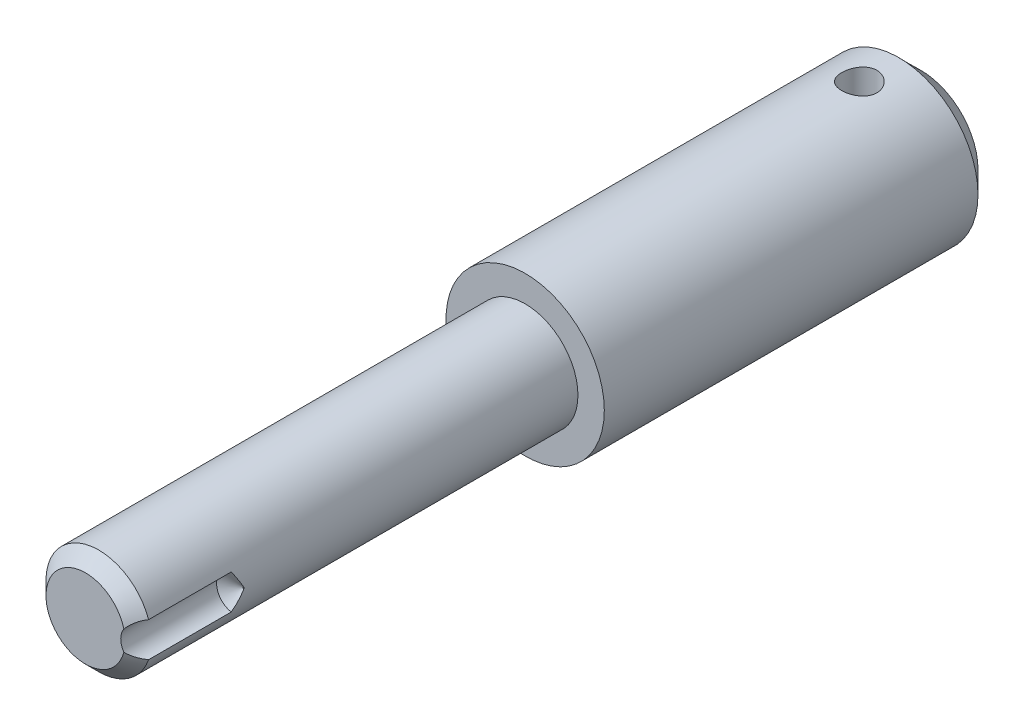
ISO-10303-21;
HEADER;
FILE_DESCRIPTION(('STEP AP214'),'2;1');
FILE_NAME('part.step','',(''),(''),'','','');
FILE_SCHEMA(('AUTOMOTIVE_DESIGN { 1 0 10303 214 1 1 1 1 }'));
ENDSEC;
DATA;
#1=APPLICATION_CONTEXT('core data for automotive mechanical design processes');
#2=APPLICATION_PROTOCOL_DEFINITION('international standard','automotive_design',2000,#1);
#3=PRODUCT_CONTEXT('',#1,'mechanical');
#4=PRODUCT('Part','Part','',(#3));
#5=PRODUCT_RELATED_PRODUCT_CATEGORY('part','',(#4));
#6=PRODUCT_DEFINITION_FORMATION('','',#4);
#7=PRODUCT_DEFINITION_CONTEXT('part definition',#1,'design');
#8=PRODUCT_DEFINITION('design','',#6,#7);
#9=PRODUCT_DEFINITION_SHAPE('','',#8);
#10=(LENGTH_UNIT() NAMED_UNIT(*) SI_UNIT(.MILLI.,.METRE.));
#11=(NAMED_UNIT(*) PLANE_ANGLE_UNIT() SI_UNIT($,.RADIAN.));
#12=(NAMED_UNIT(*) SI_UNIT($,.STERADIAN.) SOLID_ANGLE_UNIT());
#13=UNCERTAINTY_MEASURE_WITH_UNIT(LENGTH_MEASURE(1.E-05),#10,'distance_accuracy_value','');
#14=(GEOMETRIC_REPRESENTATION_CONTEXT(3) GLOBAL_UNCERTAINTY_ASSIGNED_CONTEXT((#13)) GLOBAL_UNIT_ASSIGNED_CONTEXT((#10,
#11,#12)) REPRESENTATION_CONTEXT('',''));
#15=CARTESIAN_POINT('',(0.,0.,0.));
#16=DIRECTION('',(0.,0.,1.));
#17=DIRECTION('',(1.,0.,0.));
#18=AXIS2_PLACEMENT_3D('',#15,#16,#17);
#19=CARTESIAN_POINT('',(0.,0.,95.));
#20=DIRECTION('',(0.,0.,1.));
#21=DIRECTION('',(1.,0.,0.));
#22=AXIS2_PLACEMENT_3D('',#19,#20,#21);
#23=PLANE('',#22);
#24=CARTESIAN_POINT('',(6.,0.,95.));
#25=DIRECTION('',(0.,0.,1.));
#26=DIRECTION('',(1.,0.,0.));
#27=AXIS2_PLACEMENT_3D('',#24,#25,#26);
#28=CIRCLE('',#27,2.);
#29=CARTESIAN_POINT('',(4.35416666667212,-1.13632417861579,94.9999999999449));
#30=VERTEX_POINT('',#29);
#31=CARTESIAN_POINT('',(4.35416666668207,1.13632417863019,94.9999999999568));
#32=VERTEX_POINT('',#31);
#33=EDGE_CURVE('E56',#30,#32,#28,.F.);
#34=ORIENTED_EDGE('',*,*,#33,.T.);
#35=CARTESIAN_POINT('',(0.,0.,94.9999999999136));
#36=DIRECTION('',(0.,0.,-1.));
#37=DIRECTION('',(-1.,0.,0.));
#38=AXIS2_PLACEMENT_3D('',#35,#36,#37);
#39=CIRCLE('',#38,4.50000000000728);
#40=EDGE_CURVE('E19',#30,#32,#39,.T.);
#41=ORIENTED_EDGE('',*,*,#40,.F.);
#42=EDGE_LOOP('',(#34,#41));
#43=FACE_BOUND('',#42,.T.);
#44=ADVANCED_FACE('F16',(#43),#23,.T.);
#45=CARTESIAN_POINT('',(0.,0.,93.4999999998354));
#46=DIRECTION('',(0.,0.,-1.));
#47=DIRECTION('',(-1.,0.,0.));
#48=AXIS2_PLACEMENT_3D('',#45,#46,#47);
#49=CONICAL_SURFACE('',#48,6.00000000008549,0.785398163397448);
#50=CARTESIAN_POINT('',(5.66666666662766,-1.97202659435995,93.4999999999599));
#51=CARTESIAN_POINT('',(5.58731136370315,-1.95858936429897,93.579338944694));
#52=CARTESIAN_POINT('',(5.509157179507,-1.94047495928973,93.6590825169533));
#53=CARTESIAN_POINT('',(5.35575247808671,-1.89509148490717,93.8188589984732));
#54=CARTESIAN_POINT('',(5.28050382108905,-1.86781665559849,93.8988920583595));
#55=CARTESIAN_POINT('',(5.13547117172848,-1.8051752543343,94.0564982341649));
#56=CARTESIAN_POINT('',(5.0655949983307,-1.77004363952568,94.1340800774683));
#57=CARTESIAN_POINT('',(4.92967321608421,-1.69132176651743,94.2882813796422));
#58=CARTESIAN_POINT('',(4.86362625100813,-1.64773452719373,94.3649011716257));
#59=CARTESIAN_POINT('',(4.75878945441707,-1.56908252521949,94.4892274532315));
#60=CARTESIAN_POINT('',(4.71870807082045,-1.53655490883224,94.5374628580181));
#61=CARTESIAN_POINT('',(4.64053645921032,-1.46784362500749,94.6328947923491));
#62=CARTESIAN_POINT('',(4.60244529845824,-1.43166169395065,94.6800918024337));
#63=CARTESIAN_POINT('',(4.5277986558606,-1.35482377701303,94.7739218537631));
#64=CARTESIAN_POINT('',(4.49128124529534,-1.31410110185055,94.8205309328682));
#65=CARTESIAN_POINT('',(4.42075421291011,-1.22843207351874,94.9118452581847));
#66=CARTESIAN_POINT('',(4.38674756671663,-1.18348084788457,94.9565482196868));
#67=CARTESIAN_POINT('',(4.35416666666589,-1.13632417860678,94.9999999999219));
#68=B_SPLINE_CURVE_WITH_KNOTS('',3,(#50,#51,#52,#53,#54,#55,#56,#57,#58,#59,#60,#61,#62,#63,#64,
#65,#66,#67),.UNSPECIFIED.,.F.,.F.,(4,2,2,2,2,2,2,2,4),(0.,0.338940173485475,0.678093867641629,
1.00821121188998,1.33821091192882,1.55004340594938,1.76177571520094,1.97717868630045,
2.19283297487962),.UNSPECIFIED.);
#69=CARTESIAN_POINT('',(5.66666666664716,-1.97202659436324,93.4999999999799));
#70=VERTEX_POINT('',#69);
#71=EDGE_CURVE('E60',#70,#30,#68,.T.);
#72=ORIENTED_EDGE('',*,*,#71,.T.);
#73=ORIENTED_EDGE('',*,*,#40,.T.);
#74=CARTESIAN_POINT('',(4.35416666667264,1.13632417860418,94.999999999926));
#75=CARTESIAN_POINT('',(4.39304536174543,1.19257156844811,94.9481413201713));
#76=CARTESIAN_POINT('',(4.43393721165323,1.24569186644444,94.8945342350087));
#77=CARTESIAN_POINT('',(4.51921207968946,1.34596796096177,94.7847585413084));
#78=CARTESIAN_POINT('',(4.56358997567593,1.39313225242374,94.7285937400997));
#79=CARTESIAN_POINT('',(4.65450715662631,1.4810665020417,94.6156136062617));
#80=CARTESIAN_POINT('',(4.70098620736714,1.52194462483922,94.5588332029434));
#81=CARTESIAN_POINT('',(4.79660832054046,1.59862693526952,94.4440537809019));
#82=CARTESIAN_POINT('',(4.8457526408926,1.63442869770334,94.3860541948134));
#83=CARTESIAN_POINT('',(4.95411301675924,1.7061541538256,94.2603543914784));
#84=CARTESIAN_POINT('',(5.01372091250635,1.7412612254855,94.1925256077805));
#85=CARTESIAN_POINT('',(5.13573681170663,1.80493297202715,94.0563355975283));
#86=CARTESIAN_POINT('',(5.19814468578378,1.83349794882192,93.9879743956954));
#87=CARTESIAN_POINT('',(5.32692875968902,1.88464599434818,93.8495095382937));
#88=CARTESIAN_POINT('',(5.39336376544579,1.90707260684141,93.779402708909));
#89=CARTESIAN_POINT('',(5.52844750188661,1.94487612929675,93.6394285076216));
#90=CARTESIAN_POINT('',(5.59709613623139,1.96025334561345,93.569561125444));
#91=CARTESIAN_POINT('',(5.66666666663748,1.97202659436161,93.4999999999501));
#92=B_SPLINE_CURVE_WITH_KNOTS('',3,(#74,#75,#76,#77,#78,#79,#80,#81,#82,#83,#84,#85,#86,#87,#88,
#89,#90,#91),.UNSPECIFIED.,.F.,.F.,(4,2,2,2,2,2,2,2,4),(0.,0.257236987339272,0.514102835929855,
0.765880065960838,1.01777717858197,1.30814924996324,1.59850791817821,1.89569423241721,
2.19286763022798),.UNSPECIFIED.);
#93=CARTESIAN_POINT('',(5.66666666665207,1.97202659436407,93.499999999975));
#94=VERTEX_POINT('',#93);
#95=EDGE_CURVE('E59',#32,#94,#92,.T.);
#96=ORIENTED_EDGE('',*,*,#95,.T.);
#97=CARTESIAN_POINT('',(0.,0.,93.5));
#98=DIRECTION('',(0.,0.,1.));
#99=DIRECTION('',(1.,0.,0.));
#100=AXIS2_PLACEMENT_3D('',#97,#98,#99);
#101=CIRCLE('',#100,6.);
#102=EDGE_CURVE('E116',#70,#94,#101,.F.);
#103=ORIENTED_EDGE('',*,*,#102,.F.);
#104=EDGE_LOOP('',(#72,#73,#96,#103));
#105=FACE_BOUND('',#104,.T.);
#106=ADVANCED_FACE('F63',(#105),#49,.T.);
#107=CARTESIAN_POINT('',(6.,0.,83.));
#108=DIRECTION('',(0.,0.,1.));
#109=DIRECTION('',(1.,0.,0.));
#110=AXIS2_PLACEMENT_3D('',#107,#108,#109);
#111=CYLINDRICAL_SURFACE('',#110,2.);
#112=DIRECTION('',(0.,0.,1.));
#113=VECTOR('',#112,1.);
#114=CARTESIAN_POINT('',(5.66666666666667,1.97202659436654,45.));
#115=LINE('',#114,#113);
#116=CARTESIAN_POINT('',(5.66666666666298,1.97202659437715,84.0969655114295));
#117=VERTEX_POINT('',#116);
#118=EDGE_CURVE('E68',#94,#117,#115,.F.);
#119=ORIENTED_EDGE('',*,*,#118,.F.);
#120=ORIENTED_EDGE('',*,*,#95,.F.);
#121=ORIENTED_EDGE('',*,*,#33,.F.);
#122=ORIENTED_EDGE('',*,*,#71,.F.);
#123=DIRECTION('',(0.,0.,1.));
#124=VECTOR('',#123,1.);
#125=CARTESIAN_POINT('',(5.66666666666667,-1.97202659436654,45.));
#126=LINE('',#125,#124);
#127=CARTESIAN_POINT('',(5.66666666666301,-1.97202659437705,84.0969655114231));
#128=VERTEX_POINT('',#127);
#129=EDGE_CURVE('E117',#128,#70,#126,.T.);
#130=ORIENTED_EDGE('',*,*,#129,.F.);
#131=CARTESIAN_POINT('',(6.,0.,84.096965511435));
#132=DIRECTION('',(0.,0.,1.));
#133=DIRECTION('',(0.579365558572824,0.815067818981709,0.));
#134=AXIS2_PLACEMENT_3D('',#131,#132,#133);
#135=CIRCLE('',#134,2.00000000002195);
#136=EDGE_CURVE('E70',#128,#117,#135,.F.);
#137=ORIENTED_EDGE('',*,*,#136,.T.);
#138=EDGE_LOOP('',(#119,#120,#121,#122,#130,#137));
#139=FACE_BOUND('',#138,.T.);
#140=ADVANCED_FACE('F66',(#139),#111,.F.);
#141=CARTESIAN_POINT('',(6.,0.,84.0969655113781));
#142=DIRECTION('',(0.,0.,1.));
#143=DIRECTION('',(1.,0.,0.));
#144=AXIS2_PLACEMENT_3D('',#141,#142,#143);
#145=CONICAL_SURFACE('',#144,1.99999999994269,1.04719755119325);
#146=CARTESIAN_POINT('',(5.9991666666654,-0.0999965277937368,82.9999999999865));
#147=CARTESIAN_POINT('',(5.99865088310176,-0.130933498080339,83.0178633385989));
#148=CARTESIAN_POINT('',(5.99789591844705,-0.161866631215194,83.0357261774191));
#149=CARTESIAN_POINT('',(5.99292386779685,-0.316539438930122,83.1250611272435));
#150=CARTESIAN_POINT('',(5.98511654081106,-0.440175351418314,83.1965232358825));
#151=CARTESIAN_POINT('',(5.95091151429016,-0.802693533145837,83.4065204181975));
#152=CARTESIAN_POINT('',(5.91393953940296,-1.04072609992603,83.5449965645683));
#153=CARTESIAN_POINT('',(5.83717359672253,-1.39354463856193,83.7522676408795));
#154=CARTESIAN_POINT('',(5.80798650860087,-1.51058147220522,83.8213654813088));
#155=CARTESIAN_POINT('',(5.742580327098,-1.74278690188049,83.959335689711));
#156=CARTESIAN_POINT('',(5.70636213749171,-1.85795573596498,84.0282080855067));
#157=CARTESIAN_POINT('',(5.66666666665989,-1.97202659438602,84.096965511423));
#158=B_SPLINE_CURVE_WITH_KNOTS('',3,(#146,#147,#148,#149,#150,#151,#152,#153,#154,#155,#156,
#157),.UNSPECIFIED.,.F.,.F.,(4,2,2,2,2,4),(0.,0.107182082140011,0.536054947589333,
1.36783609831082,1.78471247193166,2.20153529587136),.UNSPECIFIED.);
#159=CARTESIAN_POINT('',(5.99916666666563,-0.0999965277794674,82.9999999999782));
#160=VERTEX_POINT('',#159);
#161=EDGE_CURVE('E121',#160,#128,#158,.T.);
#162=ORIENTED_EDGE('',*,*,#161,.F.);
#163=CARTESIAN_POINT('',(6.,0.,82.99999999997));
#164=DIRECTION('',(0.,0.,1.));
#165=DIRECTION('',(1.,0.,0.));
#166=AXIS2_PLACEMENT_3D('',#163,#164,#165);
#167=CIRCLE('',#166,0.100000000047708);
#168=CARTESIAN_POINT('',(5.99916666666562,0.0999965277800654,82.999999999985));
#169=VERTEX_POINT('',#168);
#170=EDGE_CURVE('E34',#169,#160,#167,.T.);
#171=ORIENTED_EDGE('',*,*,#170,.F.);
#172=CARTESIAN_POINT('',(5.6666666666506,1.97202659437947,84.0969655114327));
#173=CARTESIAN_POINT('',(5.71921608802036,1.82105499504673,84.0059645624108));
#174=CARTESIAN_POINT('',(5.76566825439628,1.66810620039182,83.9147321723378));
#175=CARTESIAN_POINT('',(5.84600888436437,1.3599220164781,83.7323479634943));
#176=CARTESIAN_POINT('',(5.87995576324741,1.20470087341881,83.6411978065781));
#177=CARTESIAN_POINT('',(5.93541704144762,0.892193374289542,83.4586582530945));
#178=CARTESIAN_POINT('',(5.95693145819293,0.734907021114945,83.3672688568625));
#179=CARTESIAN_POINT('',(5.98751366626954,0.41844961046789,83.1839238881222));
#180=CARTESIAN_POINT('',(5.99652178962165,0.259273147541466,83.0919676897104));
#181=CARTESIAN_POINT('',(5.9991666666654,0.0999965277937354,82.9999999999865));
#182=B_SPLINE_CURVE_WITH_KNOTS('',3,(#172,#173,#174,#175,#176,#177,#178,#179,#180,#181),
.UNSPECIFIED.,.F.,.F.,(4,2,2,2,4),(0.,0.55171142461075,1.10081196882789,1.64991174330028,
2.20162239318301),.UNSPECIFIED.);
#183=EDGE_CURVE('E123',#117,#169,#182,.T.);
#184=ORIENTED_EDGE('',*,*,#183,.F.);
#185=ORIENTED_EDGE('',*,*,#136,.F.);
#186=EDGE_LOOP('',(#162,#171,#184,#185));
#187=FACE_BOUND('',#186,.T.);
#188=ADVANCED_FACE('F92',(#187),#145,.F.);
#189=CARTESIAN_POINT('',(0.,0.,83.));
#190=DIRECTION('',(0.,0.,1.));
#191=DIRECTION('',(1.,0.,0.));
#192=AXIS2_PLACEMENT_3D('',#189,#190,#191);
#193=PLANE('',#192);
#194=ORIENTED_EDGE('',*,*,#170,.T.);
#195=CARTESIAN_POINT('',(0.,0.,83.));
#196=DIRECTION('',(0.,0.,1.));
#197=DIRECTION('',(1.,0.,0.));
#198=AXIS2_PLACEMENT_3D('',#195,#196,#197);
#199=CIRCLE('',#198,6.);
#200=EDGE_CURVE('E142',#169,#160,#199,.F.);
#201=ORIENTED_EDGE('',*,*,#200,.F.);
#202=EDGE_LOOP('',(#194,#201));
#203=FACE_BOUND('',#202,.T.);
#204=ADVANCED_FACE('F159',(#203),#193,.T.);
#205=CARTESIAN_POINT('',(0.,0.,45.));
#206=DIRECTION('',(0.,0.,1.));
#207=DIRECTION('',(1.,0.,0.));
#208=AXIS2_PLACEMENT_3D('',#205,#206,#207);
#209=CYLINDRICAL_SURFACE('',#208,6.);
#210=CARTESIAN_POINT('',(0.,0.,45.));
#211=DIRECTION('',(0.,0.,1.));
#212=DIRECTION('',(1.,0.,0.));
#213=AXIS2_PLACEMENT_3D('',#210,#211,#212);
#214=CIRCLE('',#213,6.);
#215=CARTESIAN_POINT('',(6.,0.,45.));
#216=VERTEX_POINT('',#215);
#217=EDGE_CURVE('E137',#216,#216,#214,.F.);
#218=ORIENTED_EDGE('',*,*,#217,.F.);
#219=EDGE_LOOP('',(#218));
#220=FACE_BOUND('',#219,.T.);
#221=ORIENTED_EDGE('',*,*,#183,.T.);
#222=ORIENTED_EDGE('',*,*,#200,.T.);
#223=ORIENTED_EDGE('',*,*,#161,.T.);
#224=ORIENTED_EDGE('',*,*,#129,.T.);
#225=ORIENTED_EDGE('',*,*,#102,.T.);
#226=ORIENTED_EDGE('',*,*,#118,.T.);
#227=EDGE_LOOP('',(#221,#222,#223,#224,#225,#226));
#228=FACE_BOUND('',#227,.T.);
#229=ADVANCED_FACE('F154',(#220,#228),#209,.T.);
#230=CARTESIAN_POINT('',(0.,0.,0.));
#231=DIRECTION('',(0.,0.,1.));
#232=DIRECTION('',(1.,0.,0.));
#233=AXIS2_PLACEMENT_3D('',#230,#231,#232);
#234=PLANE('',#233);
#235=CARTESIAN_POINT('',(0.,0.,0.));
#236=DIRECTION('',(0.,0.,1.));
#237=DIRECTION('',(1.,0.,0.));
#238=AXIS2_PLACEMENT_3D('',#235,#236,#237);
#239=CIRCLE('',#238,6.5);
#240=CARTESIAN_POINT('',(6.5,0.,0.));
#241=VERTEX_POINT('',#240);
#242=EDGE_CURVE('E133',#241,#241,#239,.T.);
#243=ORIENTED_EDGE('',*,*,#242,.F.);
#244=EDGE_LOOP('',(#243));
#245=FACE_BOUND('',#244,.T.);
#246=ADVANCED_FACE('F158',(#245),#234,.F.);
#247=CARTESIAN_POINT('',(0.,0.,45.));
#248=DIRECTION('',(0.,0.,1.));
#249=DIRECTION('',(1.,0.,0.));
#250=AXIS2_PLACEMENT_3D('',#247,#248,#249);
#251=PLANE('',#250);
#252=ORIENTED_EDGE('',*,*,#217,.T.);
#253=EDGE_LOOP('',(#252));
#254=FACE_BOUND('',#253,.T.);
#255=CARTESIAN_POINT('',(0.,0.,45.));
#256=DIRECTION('',(0.,0.,1.));
#257=DIRECTION('',(1.,0.,0.));
#258=AXIS2_PLACEMENT_3D('',#255,#256,#257);
#259=CIRCLE('',#258,9.);
#260=CARTESIAN_POINT('',(9.,0.,45.));
#261=VERTEX_POINT('',#260);
#262=EDGE_CURVE('E128',#261,#261,#259,.F.);
#263=ORIENTED_EDGE('',*,*,#262,.F.);
#264=EDGE_LOOP('',(#263));
#265=FACE_BOUND('',#264,.T.);
#266=ADVANCED_FACE('F216',(#254,#265),#251,.T.);
#267=CARTESIAN_POINT('',(0.,0.,2.5));
#268=DIRECTION('',(0.,0.,1.));
#269=DIRECTION('',(1.,0.,0.));
#270=AXIS2_PLACEMENT_3D('',#267,#268,#269);
#271=CONICAL_SURFACE('',#270,9.,0.785398163397448);
#272=ORIENTED_EDGE('',*,*,#242,.T.);
#273=EDGE_LOOP('',(#272));
#274=FACE_BOUND('',#273,.T.);
#275=CARTESIAN_POINT('',(0.,0.,2.5));
#276=DIRECTION('',(0.,0.,1.));
#277=DIRECTION('',(1.,0.,0.));
#278=AXIS2_PLACEMENT_3D('',#275,#276,#277);
#279=CIRCLE('',#278,9.);
#280=CARTESIAN_POINT('',(9.,0.,2.5));
#281=VERTEX_POINT('',#280);
#282=EDGE_CURVE('E126',#281,#281,#279,.T.);
#283=ORIENTED_EDGE('',*,*,#282,.F.);
#284=EDGE_LOOP('',(#283));
#285=FACE_BOUND('',#284,.T.);
#286=ADVANCED_FACE('F101',(#274,#285),#271,.T.);
#287=CARTESIAN_POINT('',(0.,-25.,7.));
#288=DIRECTION('',(0.,1.,0.));
#289=DIRECTION('',(0.,0.,1.));
#290=AXIS2_PLACEMENT_3D('',#287,#288,#289);
#291=CYLINDRICAL_SURFACE('',#290,2.);
#292=CARTESIAN_POINT('',(2.,-8.77496438739212,7.));
#293=CARTESIAN_POINT('',(1.99999624947948,-8.77496662645733,6.88915763228401));
#294=CARTESIAN_POINT('',(1.99075413145665,-8.7770874535984,6.77827058734152));
#295=CARTESIAN_POINT('',(1.95407223666285,-8.78532539051412,6.55965317391113));
#296=CARTESIAN_POINT('',(1.92661957701425,-8.7914453293773,6.45192509658402));
#297=CARTESIAN_POINT('',(1.85442638312279,-8.80695492376764,6.24281957773034));
#298=CARTESIAN_POINT('',(1.8097051680061,-8.81634092424593,6.1414351859996));
#299=CARTESIAN_POINT('',(1.70430003435311,-8.83732066308218,5.94760499294287));
#300=CARTESIAN_POINT('',(1.64361633615812,-8.84891437096502,5.85515906825706));
#301=CARTESIAN_POINT('',(1.50688107459123,-8.87322903283376,5.68021742863161));
#302=CARTESIAN_POINT('',(1.4306036977922,-8.88596479825903,5.59790023788027));
#303=CARTESIAN_POINT('',(1.26533367886365,-8.91099903447159,5.44711724756097));
#304=CARTESIAN_POINT('',(1.17634002941518,-8.92329747051937,5.37865254635635));
#305=CARTESIAN_POINT('',(0.986963945237564,-8.94623292801725,5.25680924860468));
#306=CARTESIAN_POINT('',(0.886468216533076,-8.95685043407434,5.20360275054688));
#307=CARTESIAN_POINT('',(0.677686335651944,-8.97506024335485,5.11490019827952));
#308=CARTESIAN_POINT('',(0.569401088006953,-8.98265289716175,5.07940209152899));
#309=CARTESIAN_POINT('',(0.349970796328335,-8.99385284467252,5.02768656706115));
#310=CARTESIAN_POINT('',(0.238900228261922,-8.99752254926933,5.0111668907996));
#311=CARTESIAN_POINT('',(0.0155076577860236,-9.00067948952038,4.99693172912758));
#312=CARTESIAN_POINT('',(-0.0968141954765445,-9.00016721842944,4.99921402606618));
#313=CARTESIAN_POINT('',(-0.317435920934346,-8.99506549351281,5.02229372249603));
#314=CARTESIAN_POINT('',(-0.425771784327152,-8.99054779604675,5.0427652790911));
#315=CARTESIAN_POINT('',(-0.637430845543416,-8.97802477302305,5.10112266755516));
#316=CARTESIAN_POINT('',(-0.740753811742808,-8.97001928648017,5.13900930325326));
#317=CARTESIAN_POINT('',(-0.940353769390931,-8.95130538605655,5.23140697410095));
#318=CARTESIAN_POINT('',(-1.03657202089402,-8.94057712552793,5.28604071654444));
#319=CARTESIAN_POINT('',(-1.21859313654481,-8.91759271684017,5.410290093949));
#320=CARTESIAN_POINT('',(-1.30439453662954,-8.9053363543996,5.47990783106997));
#321=CARTESIAN_POINT('',(-1.46508498958083,-8.88033165726826,5.63392019385296));
#322=CARTESIAN_POINT('',(-1.53970021847621,-8.86757840960138,5.71859997597085));
#323=CARTESIAN_POINT('',(-1.67372303020546,-8.84326321441833,5.89940274761708));
#324=CARTESIAN_POINT('',(-1.73313017348813,-8.83170130134042,5.99552606777429));
#325=CARTESIAN_POINT('',(-1.83517765915972,-8.81106433565089,6.19693988834867));
#326=CARTESIAN_POINT('',(-1.8777647744073,-8.8019972048296,6.30225822280467));
#327=CARTESIAN_POINT('',(-1.94455269523168,-8.78748514090364,6.51880617128228));
#328=CARTESIAN_POINT('',(-1.96875652170475,-8.78203961268514,6.63003481085733));
#329=CARTESIAN_POINT('',(-1.99766298900203,-8.77550908494629,6.85273998705973));
#330=CARTESIAN_POINT('',(-2.00276498767797,-8.77433480250859,6.96416213103987));
#331=CARTESIAN_POINT('',(-1.99440547424347,-8.77623864525492,7.18626492296257));
#332=CARTESIAN_POINT('',(-1.98094528187579,-8.77931646812093,7.29694562305844));
#333=CARTESIAN_POINT('',(-1.93619037322696,-8.78929328275126,7.51302353749659));
#334=CARTESIAN_POINT('',(-1.90511692654434,-8.79614483669032,7.6184689752963));
#335=CARTESIAN_POINT('',(-1.82625775138724,-8.81285408505847,7.82265663112868));
#336=CARTESIAN_POINT('',(-1.77847038110013,-8.82271207479827,7.92139818949946));
#337=CARTESIAN_POINT('',(-1.66666470166548,-8.84451874051647,8.11109960177642));
#338=CARTESIAN_POINT('',(-1.60240114470844,-8.85649807643978,8.20191131498507));
#339=CARTESIAN_POINT('',(-1.45978704293772,-8.88111742013187,8.37160835740869));
#340=CARTESIAN_POINT('',(-1.38143468953093,-8.8937575125747,8.45049215302858));
#341=CARTESIAN_POINT('',(-1.21105721461462,-8.91856933927249,8.59565134350859));
#342=CARTESIAN_POINT('',(-1.11879740983627,-8.93072732731512,8.66165403586946));
#343=CARTESIAN_POINT('',(-0.924268162142588,-8.95294911443443,8.77722413423402));
#344=CARTESIAN_POINT('',(-0.821999194813062,-8.96301301294089,8.82679232063344));
#345=CARTESIAN_POINT('',(-0.611001900003296,-8.97985488719582,8.90771011463341));
#346=CARTESIAN_POINT('',(-0.502320388174407,-8.98665400218589,8.93917719589417));
#347=CARTESIAN_POINT('',(-0.28104508679559,-8.99629176699512,8.98336516001653));
#348=CARTESIAN_POINT('',(-0.168451887925187,-8.99913101212837,8.99608886071384));
#349=CARTESIAN_POINT('',(0.0548648455403718,-9.0005107520028,9.00229878236896));
#350=CARTESIAN_POINT('',(0.165576705736197,-8.99914211230489,8.99619163065926));
#351=CARTESIAN_POINT('',(0.38435404136615,-8.9924552646312,8.96582504944325));
#352=CARTESIAN_POINT('',(0.492419567343288,-8.98713713214866,8.94156596690496));
#353=CARTESIAN_POINT('',(0.702510284786641,-8.97315637064447,8.87578164280529));
#354=CARTESIAN_POINT('',(0.804554882640542,-8.9645052499262,8.83431577609928));
#355=CARTESIAN_POINT('',(1.00029152809303,-8.9447808731781,8.73535219646055));
#356=CARTESIAN_POINT('',(1.0939827357907,-8.93370737397323,8.67785287381978));
#357=CARTESIAN_POINT('',(1.27233089950998,-8.91007482615536,8.54713772253693));
#358=CARTESIAN_POINT('',(1.35677575839294,-8.89749099486293,8.47363696431056));
#359=CARTESIAN_POINT('',(1.51227173235308,-8.87238707177688,8.31357786354765));
#360=CARTESIAN_POINT('',(1.58331959999146,-8.85986699615144,8.22701636420991));
#361=CARTESIAN_POINT('',(1.71095851141984,-8.83611370166478,8.04184550021205));
#362=CARTESIAN_POINT('',(1.76733485857975,-8.82490079106851,7.94308538325932));
#363=CARTESIAN_POINT('',(1.86260026324667,-8.80528840186491,7.73726310462884));
#364=CARTESIAN_POINT('',(1.90150390773299,-8.79688657793932,7.63020795589435));
#365=CARTESIAN_POINT('',(1.95389349465735,-8.78537621740405,7.43589352594475));
#366=CARTESIAN_POINT('',(1.97114982047985,-8.78149804514396,7.34967657272651));
#367=CARTESIAN_POINT('',(1.99420426170609,-8.77629130915146,7.17564904341983));
#368=CARTESIAN_POINT('',(2.00000297215128,-8.77496261301428,7.08783855032955));
#369=CARTESIAN_POINT('',(2.,-8.77496438739212,7.));
#370=B_SPLINE_CURVE_WITH_KNOTS('',3,(#292,#293,#294,#295,#296,#297,#298,#299,#300,#301,#302,
#303,#304,#305,#306,#307,#308,#309,#310,#311,#312,#313,#314,#315,#316,#317,#318,#319,#320,#321,
#322,#323,#324,#325,#326,#327,#328,#329,#330,#331,#332,#333,#334,#335,#336,#337,#338,#339,#340,
#341,#342,#343,#344,#345,#346,#347,#348,#349,#350,#351,#352,#353,#354,#355,#356,#357,#358,#359,
#360,#361,#362,#363,#364,#365,#366,#367,#368,#369),.UNSPECIFIED.,.T.,.F.,(4,2,2,2,2,2,2,2,2,2,2,
2,2,2,2,2,2,2,2,2,2,2,2,2,2,2,2,2,2,2,2,2,2,2,2,2,2,2,4),(0.,0.332205117020653,
0.664645500445895,0.996715040077811,1.32877999616248,1.66604593919643,2.00333861356302,
2.34429812642809,2.68521811023267,3.02062971478989,3.35600175886082,3.68548441840912,
4.0149822874403,4.34695458006495,4.67897347670087,5.01812047297981,5.35727727033735,
5.69749889450325,6.0376645984937,6.37067749516634,6.70366671636337,7.03256257950694,
7.3614907592462,7.69563228727099,8.02981674004574,8.37045046043533,8.71106800344854,
9.04944929455635,9.38777970902404,9.71885587565259,10.0499257140336,10.3798625177934,
10.7098324580937,11.0462446945479,11.3827383729968,11.7239097153546,12.0647957010371,
12.3280698629932,12.5913303516713),.UNSPECIFIED.);
#371=CARTESIAN_POINT('',(2.,-8.77496438739212,7.));
#372=VERTEX_POINT('',#371);
#373=EDGE_CURVE('E25',#372,#372,#370,.T.);
#374=ORIENTED_EDGE('',*,*,#373,.F.);
#375=EDGE_LOOP('',(#374));
#376=FACE_BOUND('',#375,.T.);
#377=CARTESIAN_POINT('',(2.,8.77496438739212,7.));
#378=CARTESIAN_POINT('',(1.99999624947948,8.77496662645733,7.11084236771599));
#379=CARTESIAN_POINT('',(1.99075413145665,8.7770874535984,7.22172941265848));
#380=CARTESIAN_POINT('',(1.95407223666285,8.78532539051412,7.44034682608887));
#381=CARTESIAN_POINT('',(1.92661957701425,8.7914453293773,7.54807490341598));
#382=CARTESIAN_POINT('',(1.85442638312279,8.80695492376764,7.75718042226966));
#383=CARTESIAN_POINT('',(1.8097051680061,8.81634092424593,7.8585648140004));
#384=CARTESIAN_POINT('',(1.70430003435311,8.83732066308218,8.05239500705713));
#385=CARTESIAN_POINT('',(1.64361633615812,8.84891437096502,8.14484093174294));
#386=CARTESIAN_POINT('',(1.50688107459123,8.87322903283376,8.31978257136839));
#387=CARTESIAN_POINT('',(1.43060369779219,8.88596479825903,8.40209976211973));
#388=CARTESIAN_POINT('',(1.26533367886365,8.91099903447159,8.55288275243904));
#389=CARTESIAN_POINT('',(1.17634002941518,8.92329747051937,8.62134745364365));
#390=CARTESIAN_POINT('',(0.986963945237564,8.94623292801726,8.74319075139532));
#391=CARTESIAN_POINT('',(0.886468216533076,8.95685043407434,8.79639724945312));
#392=CARTESIAN_POINT('',(0.677686335651943,8.97506024335485,8.88509980172048));
#393=CARTESIAN_POINT('',(0.569401088006953,8.98265289716175,8.92059790847101));
#394=CARTESIAN_POINT('',(0.349970796328334,8.99385284467253,8.97231343293885));
#395=CARTESIAN_POINT('',(0.238900228261921,8.99752254926933,8.9888331092004));
#396=CARTESIAN_POINT('',(0.0155076577860225,9.00067948952038,9.00306827087242));
#397=CARTESIAN_POINT('',(-0.0968141954765455,9.00016721842944,9.00078597393382));
#398=CARTESIAN_POINT('',(-0.317435920934347,8.99506549351281,8.97770627750397));
#399=CARTESIAN_POINT('',(-0.425771784327153,8.99054779604675,8.9572347209089));
#400=CARTESIAN_POINT('',(-0.637430845543417,8.97802477302305,8.89887733244484));
#401=CARTESIAN_POINT('',(-0.740753811742809,8.97001928648017,8.86099069674674));
#402=CARTESIAN_POINT('',(-0.940353769390931,8.95130538605655,8.76859302589905));
#403=CARTESIAN_POINT('',(-1.03657202089402,8.94057712552793,8.71395928345556));
#404=CARTESIAN_POINT('',(-1.21859313654481,8.91759271684017,8.589709906051));
#405=CARTESIAN_POINT('',(-1.30439453662954,8.9053363543996,8.52009216893003));
#406=CARTESIAN_POINT('',(-1.46508498958083,8.88033165726826,8.36607980614704));
#407=CARTESIAN_POINT('',(-1.53970021847621,8.86757840960138,8.28140002402915));
#408=CARTESIAN_POINT('',(-1.67372303020546,8.84326321441833,8.10059725238292));
#409=CARTESIAN_POINT('',(-1.73313017348813,8.83170130134042,8.00447393222571));
#410=CARTESIAN_POINT('',(-1.83517765915972,8.81106433565089,7.80306011165132));
#411=CARTESIAN_POINT('',(-1.8777647744073,8.8019972048296,7.69774177719533));
#412=CARTESIAN_POINT('',(-1.94455269523168,8.78748514090364,7.48119382871772));
#413=CARTESIAN_POINT('',(-1.96875652170475,8.78203961268514,7.36996518914267));
#414=CARTESIAN_POINT('',(-1.99766298900203,8.77550908494629,7.14726001294027));
#415=CARTESIAN_POINT('',(-2.00276498767797,8.77433480250859,7.03583786896013));
#416=CARTESIAN_POINT('',(-1.99440547424347,8.77623864525492,6.81373507703744));
#417=CARTESIAN_POINT('',(-1.98094528187579,8.77931646812093,6.70305437694156));
#418=CARTESIAN_POINT('',(-1.93619037322696,8.78929328275126,6.48697646250342));
#419=CARTESIAN_POINT('',(-1.90511692654434,8.79614483669032,6.38153102470371));
#420=CARTESIAN_POINT('',(-1.82625775138724,8.81285408505847,6.17734336887132));
#421=CARTESIAN_POINT('',(-1.77847038110013,8.82271207479827,6.07860181050054));
#422=CARTESIAN_POINT('',(-1.66666470166548,8.84451874051647,5.88890039822358));
#423=CARTESIAN_POINT('',(-1.60240114470844,8.85649807643978,5.79808868501493));
#424=CARTESIAN_POINT('',(-1.45978704293772,8.88111742013187,5.62839164259131));
#425=CARTESIAN_POINT('',(-1.38143468953094,8.8937575125747,5.54950784697142));
#426=CARTESIAN_POINT('',(-1.21105721461462,8.91856933927249,5.40434865649141));
#427=CARTESIAN_POINT('',(-1.11879740983628,8.93072732731512,5.33834596413054));
#428=CARTESIAN_POINT('',(-0.924268162142588,8.95294911443443,5.22277586576598));
#429=CARTESIAN_POINT('',(-0.821999194813062,8.96301301294089,5.17320767936656));
#430=CARTESIAN_POINT('',(-0.611001900003295,8.97985488719582,5.09228988536659));
#431=CARTESIAN_POINT('',(-0.502320388174406,8.98665400218589,5.06082280410584));
#432=CARTESIAN_POINT('',(-0.28104508679559,8.99629176699512,5.01663483998347));
#433=CARTESIAN_POINT('',(-0.168451887925187,8.99913101212837,5.00391113928616));
#434=CARTESIAN_POINT('',(0.0548648455403722,9.0005107520028,4.99770121763104));
#435=CARTESIAN_POINT('',(0.165576705736197,8.99914211230489,5.00380836934074));
#436=CARTESIAN_POINT('',(0.384354041366151,8.9924552646312,5.03417495055675));
#437=CARTESIAN_POINT('',(0.492419567343289,8.98713713214866,5.05843403309504));
#438=CARTESIAN_POINT('',(0.702510284786642,8.97315637064447,5.12421835719471));
#439=CARTESIAN_POINT('',(0.804554882640544,8.9645052499262,5.16568422390072));
#440=CARTESIAN_POINT('',(1.00029152809303,8.9447808731781,5.26464780353945));
#441=CARTESIAN_POINT('',(1.0939827357907,8.93370737397323,5.32214712618023));
#442=CARTESIAN_POINT('',(1.27233089950998,8.91007482615536,5.45286227746307));
#443=CARTESIAN_POINT('',(1.35677575839294,8.89749099486293,5.52636303568945));
#444=CARTESIAN_POINT('',(1.51227173235308,8.87238707177688,5.68642213645236));
#445=CARTESIAN_POINT('',(1.58331959999146,8.85986699615144,5.77298363579009));
#446=CARTESIAN_POINT('',(1.71095851141984,8.83611370166478,5.95815449978795));
#447=CARTESIAN_POINT('',(1.76733485857975,8.82490079106851,6.05691461674068));
#448=CARTESIAN_POINT('',(1.86260026324667,8.80528840186491,6.26273689537117));
#449=CARTESIAN_POINT('',(1.90150390773299,8.79688657793932,6.36979204410566));
#450=CARTESIAN_POINT('',(1.95389349465735,8.78537621740405,6.56410647405525));
#451=CARTESIAN_POINT('',(1.97114982047985,8.78149804514396,6.65032342727349));
#452=CARTESIAN_POINT('',(1.99420426170609,8.77629130915146,6.82435095658017));
#453=CARTESIAN_POINT('',(2.00000297215128,8.77496261301428,6.91216144967045));
#454=CARTESIAN_POINT('',(2.,8.77496438739212,7.));
#455=B_SPLINE_CURVE_WITH_KNOTS('',3,(#377,#378,#379,#380,#381,#382,#383,#384,#385,#386,#387,
#388,#389,#390,#391,#392,#393,#394,#395,#396,#397,#398,#399,#400,#401,#402,#403,#404,#405,#406,
#407,#408,#409,#410,#411,#412,#413,#414,#415,#416,#417,#418,#419,#420,#421,#422,#423,#424,#425,
#426,#427,#428,#429,#430,#431,#432,#433,#434,#435,#436,#437,#438,#439,#440,#441,#442,#443,#444,
#445,#446,#447,#448,#449,#450,#451,#452,#453,#454),.UNSPECIFIED.,.T.,.F.,(4,2,2,2,2,2,2,2,2,2,2,
2,2,2,2,2,2,2,2,2,2,2,2,2,2,2,2,2,2,2,2,2,2,2,2,2,2,2,4),(0.,0.332205117020653,
0.664645500445895,0.996715040077811,1.32877999616248,1.66604593919643,2.00333861356302,
2.34429812642809,2.68521811023267,3.02062971478989,3.35600175886082,3.68548441840912,
4.0149822874403,4.34695458006495,4.67897347670087,5.01812047297982,5.35727727033735,
5.69749889450325,6.0376645984937,6.37067749516634,6.70366671636337,7.03256257950694,
7.3614907592462,7.69563228727099,8.02981674004573,8.37045046043533,8.71106800344854,
9.04944929455635,9.38777970902404,9.7188558756526,10.0499257140336,10.3798625177934,
10.7098324580937,11.0462446945479,11.3827383729968,11.7239097153546,12.0647957010371,
12.3280698629932,12.5913303516713),.UNSPECIFIED.);
#456=CARTESIAN_POINT('',(2.,8.77496438739212,7.));
#457=VERTEX_POINT('',#456);
#458=EDGE_CURVE('E11',#457,#457,#455,.T.);
#459=ORIENTED_EDGE('',*,*,#458,.F.);
#460=EDGE_LOOP('',(#459));
#461=FACE_BOUND('',#460,.T.);
#462=ADVANCED_FACE('F95',(#376,#461),#291,.F.);
#463=CARTESIAN_POINT('',(0.,0.,0.));
#464=DIRECTION('',(0.,0.,1.));
#465=DIRECTION('',(1.,0.,0.));
#466=AXIS2_PLACEMENT_3D('',#463,#464,#465);
#467=CYLINDRICAL_SURFACE('',#466,9.);
#468=ORIENTED_EDGE('',*,*,#458,.T.);
#469=EDGE_LOOP('',(#468));
#470=FACE_BOUND('',#469,.T.);
#471=ORIENTED_EDGE('',*,*,#373,.T.);
#472=EDGE_LOOP('',(#471));
#473=FACE_BOUND('',#472,.T.);
#474=ORIENTED_EDGE('',*,*,#282,.T.);
#475=EDGE_LOOP('',(#474));
#476=FACE_BOUND('',#475,.T.);
#477=ORIENTED_EDGE('',*,*,#262,.T.);
#478=EDGE_LOOP('',(#477));
#479=FACE_BOUND('',#478,.T.);
#480=ADVANCED_FACE('F93',(#470,#473,#476,#479),#467,.T.);
#481=CLOSED_SHELL('',(#44,#106,#140,#188,#204,#229,#246,#266,#286,#462,#480));
#482=MANIFOLD_SOLID_BREP('B1',#481);
#483=ADVANCED_BREP_SHAPE_REPRESENTATION('',(#18,#482),#14);
#484=SHAPE_DEFINITION_REPRESENTATION(#9,#483);
ENDSEC;
END-ISO-10303-21;
